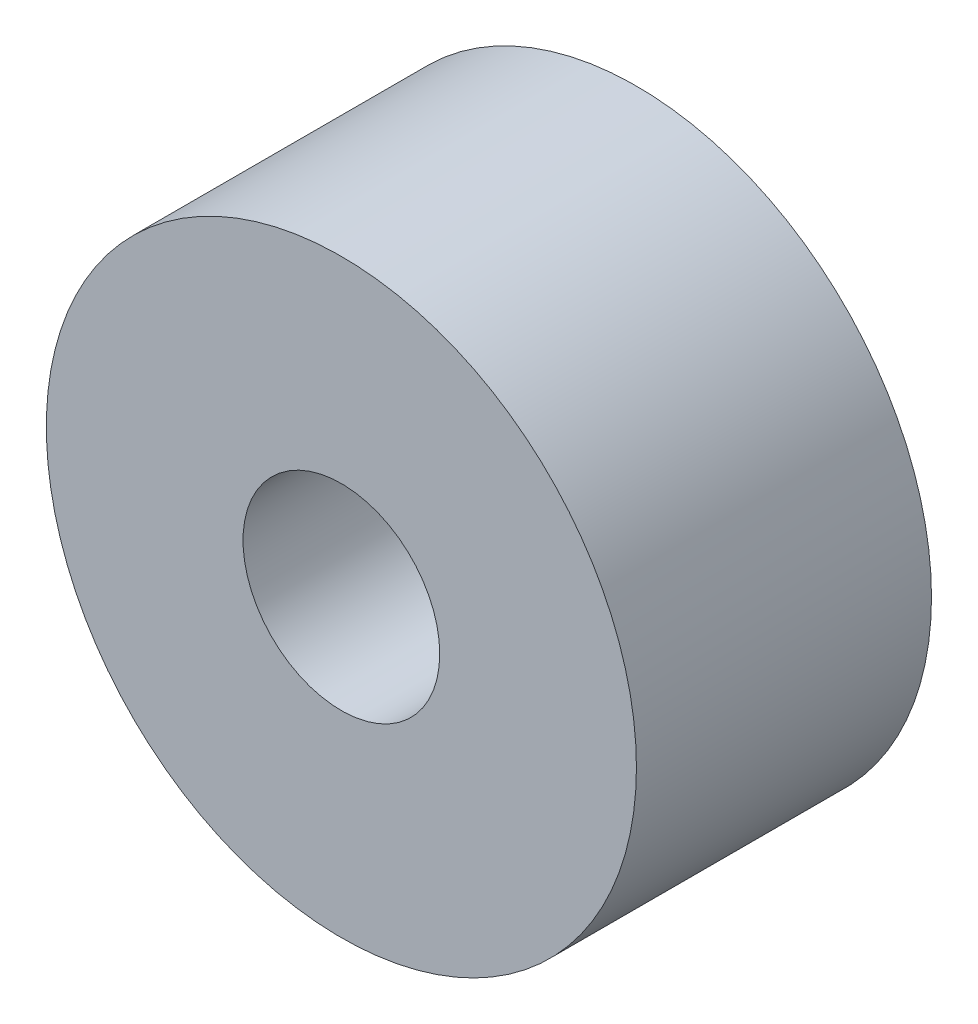
ISO-10303-21;
HEADER;
FILE_DESCRIPTION(('STEP AP214'),'2;1');
FILE_NAME('part.step','',(''),(''),'','','');
FILE_SCHEMA(('AUTOMOTIVE_DESIGN { 1 0 10303 214 1 1 1 1 }'));
ENDSEC;
DATA;
#1=APPLICATION_CONTEXT('core data for automotive mechanical design processes');
#2=APPLICATION_PROTOCOL_DEFINITION('international standard','automotive_design',2000,#1);
#3=PRODUCT_CONTEXT('',#1,'mechanical');
#4=PRODUCT('Part','Part','',(#3));
#5=PRODUCT_RELATED_PRODUCT_CATEGORY('part','',(#4));
#6=PRODUCT_DEFINITION_FORMATION('','',#4);
#7=PRODUCT_DEFINITION_CONTEXT('part definition',#1,'design');
#8=PRODUCT_DEFINITION('design','',#6,#7);
#9=PRODUCT_DEFINITION_SHAPE('','',#8);
#10=(LENGTH_UNIT() NAMED_UNIT(*) SI_UNIT(.MILLI.,.METRE.));
#11=(NAMED_UNIT(*) PLANE_ANGLE_UNIT() SI_UNIT($,.RADIAN.));
#12=(NAMED_UNIT(*) SI_UNIT($,.STERADIAN.) SOLID_ANGLE_UNIT());
#13=UNCERTAINTY_MEASURE_WITH_UNIT(LENGTH_MEASURE(1.E-05),#10,'distance_accuracy_value','');
#14=(GEOMETRIC_REPRESENTATION_CONTEXT(3) GLOBAL_UNCERTAINTY_ASSIGNED_CONTEXT((#13)) GLOBAL_UNIT_ASSIGNED_CONTEXT((#10,
#11,#12)) REPRESENTATION_CONTEXT('',''));
#15=CARTESIAN_POINT('',(0.,0.,0.));
#16=DIRECTION('',(0.,0.,1.));
#17=DIRECTION('',(1.,0.,0.));
#18=AXIS2_PLACEMENT_3D('',#15,#16,#17);
#19=CARTESIAN_POINT('',(0.,0.,15.));
#20=DIRECTION('',(0.,0.,1.));
#21=DIRECTION('',(1.,0.,0.));
#22=AXIS2_PLACEMENT_3D('',#19,#20,#21);
#23=PLANE('',#22);
#24=CARTESIAN_POINT('',(0.,0.,15.));
#25=DIRECTION('',(0.,0.,1.));
#26=DIRECTION('',(1.,0.,0.));
#27=AXIS2_PLACEMENT_3D('',#24,#25,#26);
#28=CIRCLE('',#27,15.);
#29=CARTESIAN_POINT('',(15.,0.,15.));
#30=VERTEX_POINT('',#29);
#31=EDGE_CURVE('E10',#30,#30,#28,.T.);
#32=ORIENTED_EDGE('',*,*,#31,.T.);
#33=EDGE_LOOP('',(#32));
#34=FACE_BOUND('',#33,.T.);
#35=CARTESIAN_POINT('',(0.,0.,15.));
#36=DIRECTION('',(0.,0.,1.));
#37=DIRECTION('',(1.,0.,0.));
#38=AXIS2_PLACEMENT_3D('',#35,#36,#37);
#39=CIRCLE('',#38,5.);
#40=CARTESIAN_POINT('',(5.,0.,15.));
#41=VERTEX_POINT('',#40);
#42=EDGE_CURVE('E42',#41,#41,#39,.T.);
#43=ORIENTED_EDGE('',*,*,#42,.F.);
#44=EDGE_LOOP('',(#43));
#45=FACE_BOUND('',#44,.T.);
#46=ADVANCED_FACE('F31',(#34,#45),#23,.T.);
#47=CARTESIAN_POINT('',(0.,0.,0.));
#48=DIRECTION('',(0.,0.,1.));
#49=DIRECTION('',(1.,0.,0.));
#50=AXIS2_PLACEMENT_3D('',#47,#48,#49);
#51=PLANE('',#50);
#52=CARTESIAN_POINT('',(0.,0.,0.));
#53=DIRECTION('',(0.,0.,1.));
#54=DIRECTION('',(1.,0.,0.));
#55=AXIS2_PLACEMENT_3D('',#52,#53,#54);
#56=CIRCLE('',#55,15.);
#57=CARTESIAN_POINT('',(15.,0.,0.));
#58=VERTEX_POINT('',#57);
#59=EDGE_CURVE('E35',#58,#58,#56,.T.);
#60=ORIENTED_EDGE('',*,*,#59,.F.);
#61=EDGE_LOOP('',(#60));
#62=FACE_BOUND('',#61,.T.);
#63=CARTESIAN_POINT('',(0.,0.,0.));
#64=DIRECTION('',(0.,0.,1.));
#65=DIRECTION('',(1.,0.,0.));
#66=AXIS2_PLACEMENT_3D('',#63,#64,#65);
#67=CIRCLE('',#66,5.);
#68=CARTESIAN_POINT('',(5.,0.,0.));
#69=VERTEX_POINT('',#68);
#70=EDGE_CURVE('E44',#69,#69,#67,.T.);
#71=ORIENTED_EDGE('',*,*,#70,.T.);
#72=EDGE_LOOP('',(#71));
#73=FACE_BOUND('',#72,.T.);
#74=ADVANCED_FACE('F54',(#62,#73),#51,.F.);
#75=CARTESIAN_POINT('',(0.,0.,15.));
#76=DIRECTION('',(0.,0.,-1.));
#77=DIRECTION('',(-1.,0.,0.));
#78=AXIS2_PLACEMENT_3D('',#75,#76,#77);
#79=CYLINDRICAL_SURFACE('',#78,15.);
#80=ORIENTED_EDGE('',*,*,#31,.F.);
#81=EDGE_LOOP('',(#80));
#82=FACE_BOUND('',#81,.T.);
#83=ORIENTED_EDGE('',*,*,#59,.T.);
#84=EDGE_LOOP('',(#83));
#85=FACE_BOUND('',#84,.T.);
#86=ADVANCED_FACE('F33',(#82,#85),#79,.T.);
#87=CARTESIAN_POINT('',(0.,0.,15.));
#88=DIRECTION('',(0.,0.,-1.));
#89=DIRECTION('',(-1.,0.,0.));
#90=AXIS2_PLACEMENT_3D('',#87,#88,#89);
#91=CYLINDRICAL_SURFACE('',#90,5.);
#92=ORIENTED_EDGE('',*,*,#42,.T.);
#93=EDGE_LOOP('',(#92));
#94=FACE_BOUND('',#93,.T.);
#95=ORIENTED_EDGE('',*,*,#70,.F.);
#96=EDGE_LOOP('',(#95));
#97=FACE_BOUND('',#96,.T.);
#98=ADVANCED_FACE('F50',(#94,#97),#91,.F.);
#99=CLOSED_SHELL('',(#46,#74,#86,#98));
#100=MANIFOLD_SOLID_BREP('B2',#99);
#101=ADVANCED_BREP_SHAPE_REPRESENTATION('',(#18,#100),#14);
#102=SHAPE_DEFINITION_REPRESENTATION(#9,#101);
ENDSEC;
END-ISO-10303-21;
